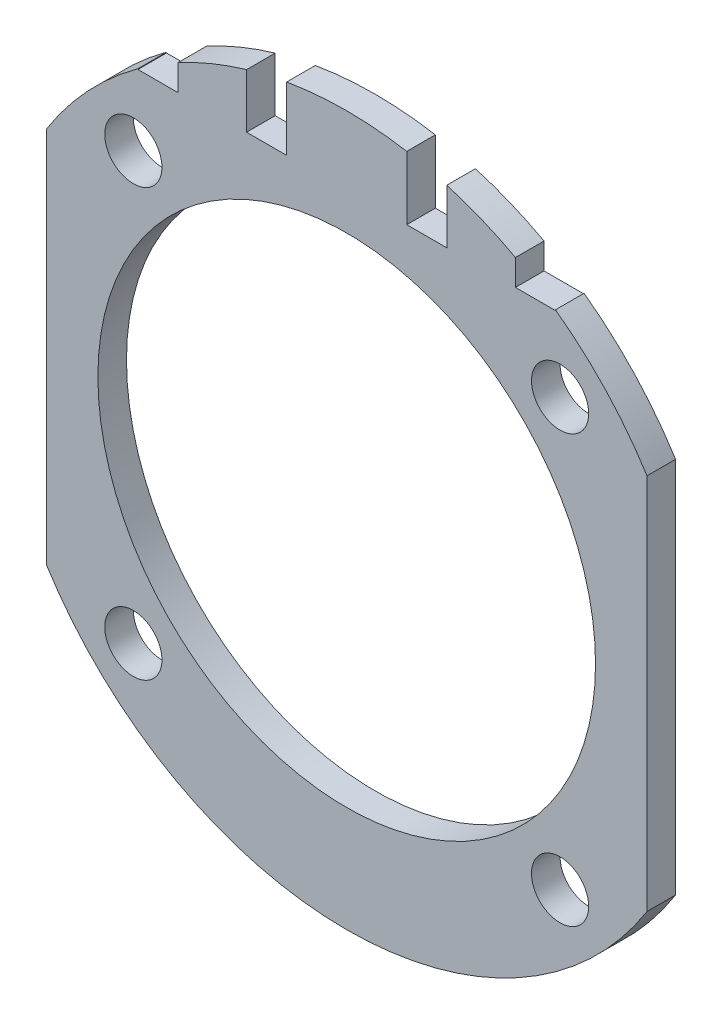
ISO-10303-21;
HEADER;
FILE_DESCRIPTION(('STEP AP214'),'2;1');
FILE_NAME('part.step','',(''),(''),'','','');
FILE_SCHEMA(('AUTOMOTIVE_DESIGN { 1 0 10303 214 1 1 1 1 }'));
ENDSEC;
DATA;
#1=APPLICATION_CONTEXT('core data for automotive mechanical design processes');
#2=APPLICATION_PROTOCOL_DEFINITION('international standard','automotive_design',2000,#1);
#3=PRODUCT_CONTEXT('',#1,'mechanical');
#4=PRODUCT('Part','Part','',(#3));
#5=PRODUCT_RELATED_PRODUCT_CATEGORY('part','',(#4));
#6=PRODUCT_DEFINITION_FORMATION('','',#4);
#7=PRODUCT_DEFINITION_CONTEXT('part definition',#1,'design');
#8=PRODUCT_DEFINITION('design','',#6,#7);
#9=PRODUCT_DEFINITION_SHAPE('','',#8);
#10=(LENGTH_UNIT() NAMED_UNIT(*) SI_UNIT(.MILLI.,.METRE.));
#11=(NAMED_UNIT(*) PLANE_ANGLE_UNIT() SI_UNIT($,.RADIAN.));
#12=(NAMED_UNIT(*) SI_UNIT($,.STERADIAN.) SOLID_ANGLE_UNIT());
#13=UNCERTAINTY_MEASURE_WITH_UNIT(LENGTH_MEASURE(1.E-05),#10,'distance_accuracy_value','');
#14=(GEOMETRIC_REPRESENTATION_CONTEXT(3) GLOBAL_UNCERTAINTY_ASSIGNED_CONTEXT((#13)) GLOBAL_UNIT_ASSIGNED_CONTEXT((#10,
#11,#12)) REPRESENTATION_CONTEXT('',''));
#15=CARTESIAN_POINT('',(0.,0.,0.));
#16=DIRECTION('',(0.,0.,1.));
#17=DIRECTION('',(1.,0.,0.));
#18=AXIS2_PLACEMENT_3D('',#15,#16,#17);
#19=CARTESIAN_POINT('',(0.,0.,5.));
#20=DIRECTION('',(0.,0.,-1.));
#21=DIRECTION('',(-1.,0.,0.));
#22=AXIS2_PLACEMENT_3D('',#19,#20,#21);
#23=CYLINDRICAL_SURFACE('',#22,124.);
#24=CARTESIAN_POINT('',(0.,0.,-5.));
#25=DIRECTION('',(0.,0.,1.));
#26=DIRECTION('',(1.,0.,0.));
#27=AXIS2_PLACEMENT_3D('',#24,#25,#26);
#28=CIRCLE('',#27,124.);
#29=CARTESIAN_POINT('',(-35.0000000000592,118.957975772942,-5.));
#30=VERTEX_POINT('',#29);
#31=CARTESIAN_POINT('',(-59.,109.064201276129,-5.));
#32=VERTEX_POINT('',#31);
#33=EDGE_CURVE('E423',#30,#32,#28,.T.);
#34=ORIENTED_EDGE('',*,*,#33,.T.);
#35=DIRECTION('',(0.,0.,-1.));
#36=VECTOR('',#35,1.);
#37=CARTESIAN_POINT('',(-59.,109.064201276129,5.));
#38=LINE('',#37,#36);
#39=CARTESIAN_POINT('',(-59.,109.064201276129,5.));
#40=VERTEX_POINT('',#39);
#41=EDGE_CURVE('E12',#32,#40,#38,.F.);
#42=ORIENTED_EDGE('',*,*,#41,.T.);
#43=CARTESIAN_POINT('',(0.,0.,5.));
#44=DIRECTION('',(0.,0.,1.));
#45=DIRECTION('',(1.,0.,0.));
#46=AXIS2_PLACEMENT_3D('',#43,#44,#45);
#47=CIRCLE('',#46,124.);
#48=CARTESIAN_POINT('',(-35.0000000000592,118.957975772942,5.));
#49=VERTEX_POINT('',#48);
#50=EDGE_CURVE('E462',#49,#40,#47,.T.);
#51=ORIENTED_EDGE('',*,*,#50,.F.);
#52=DIRECTION('',(0.,0.,-1.));
#53=VECTOR('',#52,1.);
#54=CARTESIAN_POINT('',(-35.0000000000592,118.957975772942,5.));
#55=LINE('',#54,#53);
#56=EDGE_CURVE('E393',#49,#30,#55,.T.);
#57=ORIENTED_EDGE('',*,*,#56,.T.);
#58=EDGE_LOOP('',(#34,#42,#51,#57));
#59=FACE_BOUND('',#58,.T.);
#60=ADVANCED_FACE('F44',(#59),#23,.T.);
#61=CARTESIAN_POINT('',(59.,109.064201276129,-5.));
#62=VERTEX_POINT('',#61);
#63=CARTESIAN_POINT('',(34.9999999999409,118.957975772977,-5.));
#64=VERTEX_POINT('',#63);
#65=EDGE_CURVE('E372',#62,#64,#28,.T.);
#66=ORIENTED_EDGE('',*,*,#65,.T.);
#67=DIRECTION('',(0.,0.,-1.));
#68=VECTOR('',#67,1.);
#69=CARTESIAN_POINT('',(34.9999999999409,118.957975772977,5.));
#70=LINE('',#69,#68);
#71=CARTESIAN_POINT('',(34.9999999999409,118.957975772977,5.));
#72=VERTEX_POINT('',#71);
#73=EDGE_CURVE('E404',#64,#72,#70,.F.);
#74=ORIENTED_EDGE('',*,*,#73,.T.);
#75=CARTESIAN_POINT('',(59.,109.064201276129,5.));
#76=VERTEX_POINT('',#75);
#77=EDGE_CURVE('E365',#76,#72,#47,.T.);
#78=ORIENTED_EDGE('',*,*,#77,.F.);
#79=DIRECTION('',(0.,0.,-1.));
#80=VECTOR('',#79,1.);
#81=CARTESIAN_POINT('',(59.,109.064201276129,5.));
#82=LINE('',#81,#80);
#83=EDGE_CURVE('E385',#76,#62,#82,.T.);
#84=ORIENTED_EDGE('',*,*,#83,.T.);
#85=EDGE_LOOP('',(#66,#74,#78,#84));
#86=FACE_BOUND('',#85,.T.);
#87=ADVANCED_FACE('F445',(#86),#23,.T.);
#88=CARTESIAN_POINT('',(20.9999999999419,122.208837650975,5.));
#89=VERTEX_POINT('',#88);
#90=CARTESIAN_POINT('',(-21.0000000000592,122.208837650955,5.));
#91=VERTEX_POINT('',#90);
#92=EDGE_CURVE('E458',#89,#91,#47,.T.);
#93=ORIENTED_EDGE('',*,*,#92,.F.);
#94=DIRECTION('',(0.,0.,-1.));
#95=VECTOR('',#94,1.);
#96=CARTESIAN_POINT('',(20.9999999999419,122.208837650975,5.));
#97=LINE('',#96,#95);
#98=CARTESIAN_POINT('',(20.9999999999419,122.208837650975,-5.));
#99=VERTEX_POINT('',#98);
#100=EDGE_CURVE('E400',#89,#99,#97,.T.);
#101=ORIENTED_EDGE('',*,*,#100,.T.);
#102=CARTESIAN_POINT('',(-21.0000000000592,122.208837650955,-5.));
#103=VERTEX_POINT('',#102);
#104=EDGE_CURVE('E427',#99,#103,#28,.T.);
#105=ORIENTED_EDGE('',*,*,#104,.T.);
#106=DIRECTION('',(0.,0.,-1.));
#107=VECTOR('',#106,1.);
#108=CARTESIAN_POINT('',(-21.0000000000592,122.208837650955,5.));
#109=LINE('',#108,#107);
#110=EDGE_CURVE('E396',#103,#91,#109,.F.);
#111=ORIENTED_EDGE('',*,*,#110,.T.);
#112=EDGE_LOOP('',(#93,#101,#105,#111));
#113=FACE_BOUND('',#112,.T.);
#114=ADVANCED_FACE('F483',(#113),#23,.T.);
#115=CARTESIAN_POINT('',(105.,65.962110336162,-5.));
#116=VERTEX_POINT('',#115);
#117=CARTESIAN_POINT('',(73.,100.234724521994,-5.));
#118=VERTEX_POINT('',#117);
#119=EDGE_CURVE('E368',#116,#118,#28,.T.);
#120=ORIENTED_EDGE('',*,*,#119,.T.);
#121=DIRECTION('',(0.,0.,-1.));
#122=VECTOR('',#121,1.);
#123=CARTESIAN_POINT('',(73.,100.234724521994,5.));
#124=LINE('',#123,#122);
#125=CARTESIAN_POINT('',(73.,100.234724521994,5.));
#126=VERTEX_POINT('',#125);
#127=EDGE_CURVE('E389',#118,#126,#124,.F.);
#128=ORIENTED_EDGE('',*,*,#127,.T.);
#129=CARTESIAN_POINT('',(105.,65.962110336162,5.));
#130=VERTEX_POINT('',#129);
#131=EDGE_CURVE('E360',#130,#126,#47,.T.);
#132=ORIENTED_EDGE('',*,*,#131,.F.);
#133=DIRECTION('',(0.,0.,-1.));
#134=VECTOR('',#133,1.);
#135=CARTESIAN_POINT('',(105.,65.962110336162,5.));
#136=LINE('',#135,#134);
#137=EDGE_CURVE('E379',#116,#130,#136,.F.);
#138=ORIENTED_EDGE('',*,*,#137,.F.);
#139=EDGE_LOOP('',(#120,#128,#132,#138));
#140=FACE_BOUND('',#139,.T.);
#141=ADVANCED_FACE('F512',(#140),#23,.T.);
#142=CARTESIAN_POINT('',(0.,0.,5.));
#143=DIRECTION('',(0.,0.,1.));
#144=DIRECTION('',(1.,0.,0.));
#145=AXIS2_PLACEMENT_3D('',#142,#143,#144);
#146=PLANE('',#145);
#147=DIRECTION('',(0.,1.,0.));
#148=VECTOR('',#147,1.);
#149=CARTESIAN_POINT('',(-59.,0.,5.));
#150=LINE('',#149,#148);
#151=CARTESIAN_POINT('',(-59.,100.,5.));
#152=VERTEX_POINT('',#151);
#153=EDGE_CURVE('E290',#152,#40,#150,.T.);
#154=ORIENTED_EDGE('',*,*,#153,.F.);
#155=DIRECTION('',(1.,0.,0.));
#156=VECTOR('',#155,1.);
#157=CARTESIAN_POINT('',(0.,100.,5.));
#158=LINE('',#157,#156);
#159=CARTESIAN_POINT('',(-73.,100.,5.));
#160=VERTEX_POINT('',#159);
#161=EDGE_CURVE('E302',#160,#152,#158,.T.);
#162=ORIENTED_EDGE('',*,*,#161,.F.);
#163=DIRECTION('',(0.,-1.,0.));
#164=VECTOR('',#163,1.);
#165=CARTESIAN_POINT('',(-73.,0.,5.));
#166=LINE('',#165,#164);
#167=CARTESIAN_POINT('',(-73.,100.234724521994,5.));
#168=VERTEX_POINT('',#167);
#169=EDGE_CURVE('E184',#168,#160,#166,.T.);
#170=ORIENTED_EDGE('',*,*,#169,.F.);
#171=CARTESIAN_POINT('',(-105.,65.9621103361619,5.));
#172=VERTEX_POINT('',#171);
#173=EDGE_CURVE('E366',#168,#172,#47,.T.);
#174=ORIENTED_EDGE('',*,*,#173,.T.);
#175=DIRECTION('',(0.,-1.,0.));
#176=VECTOR('',#175,1.);
#177=CARTESIAN_POINT('',(-105.,0.,5.));
#178=LINE('',#177,#176);
#179=CARTESIAN_POINT('',(-105.,-65.9621103361619,5.));
#180=VERTEX_POINT('',#179);
#181=EDGE_CURVE('E311',#172,#180,#178,.T.);
#182=ORIENTED_EDGE('',*,*,#181,.T.);
#183=CARTESIAN_POINT('',(105.,-65.962110336162,5.));
#184=VERTEX_POINT('',#183);
#185=EDGE_CURVE('E367',#180,#184,#47,.T.);
#186=ORIENTED_EDGE('',*,*,#185,.T.);
#187=DIRECTION('',(0.,1.,0.));
#188=VECTOR('',#187,1.);
#189=CARTESIAN_POINT('',(105.,0.,5.));
#190=LINE('',#189,#188);
#191=EDGE_CURVE('E315',#184,#130,#190,.T.);
#192=ORIENTED_EDGE('',*,*,#191,.T.);
#193=ORIENTED_EDGE('',*,*,#131,.T.);
#194=DIRECTION('',(0.,1.,0.));
#195=VECTOR('',#194,1.);
#196=CARTESIAN_POINT('',(73.,0.,5.));
#197=LINE('',#196,#195);
#198=CARTESIAN_POINT('',(73.,100.,5.));
#199=VERTEX_POINT('',#198);
#200=EDGE_CURVE('E273',#199,#126,#197,.T.);
#201=ORIENTED_EDGE('',*,*,#200,.F.);
#202=DIRECTION('',(1.,0.,0.));
#203=VECTOR('',#202,1.);
#204=CARTESIAN_POINT('',(0.,100.,5.));
#205=LINE('',#204,#203);
#206=CARTESIAN_POINT('',(59.,100.,5.));
#207=VERTEX_POINT('',#206);
#208=EDGE_CURVE('E293',#207,#199,#205,.T.);
#209=ORIENTED_EDGE('',*,*,#208,.F.);
#210=DIRECTION('',(0.,-1.,0.));
#211=VECTOR('',#210,1.);
#212=CARTESIAN_POINT('',(59.,0.,5.));
#213=LINE('',#212,#211);
#214=EDGE_CURVE('E212',#76,#207,#213,.T.);
#215=ORIENTED_EDGE('',*,*,#214,.F.);
#216=ORIENTED_EDGE('',*,*,#77,.T.);
#217=DIRECTION('',(0.,1.,0.));
#218=VECTOR('',#217,1.);
#219=CARTESIAN_POINT('',(34.9999999999409,0.,5.));
#220=LINE('',#219,#218);
#221=CARTESIAN_POINT('',(34.9999999999409,99.9999999999815,5.));
#222=VERTEX_POINT('',#221);
#223=EDGE_CURVE('E285',#222,#72,#220,.T.);
#224=ORIENTED_EDGE('',*,*,#223,.F.);
#225=DIRECTION('',(1.,0.,0.));
#226=VECTOR('',#225,1.);
#227=CARTESIAN_POINT('',(0.,99.9999999999815,5.));
#228=LINE('',#227,#226);
#229=CARTESIAN_POINT('',(20.9999999999419,99.9999999999815,5.));
#230=VERTEX_POINT('',#229);
#231=EDGE_CURVE('E299',#230,#222,#228,.T.);
#232=ORIENTED_EDGE('',*,*,#231,.F.);
#233=DIRECTION('',(0.,-1.,0.));
#234=VECTOR('',#233,1.);
#235=CARTESIAN_POINT('',(20.9999999999419,0.,5.));
#236=LINE('',#235,#234);
#237=EDGE_CURVE('E282',#89,#230,#236,.T.);
#238=ORIENTED_EDGE('',*,*,#237,.F.);
#239=ORIENTED_EDGE('',*,*,#92,.T.);
#240=DIRECTION('',(0.,1.,0.));
#241=VECTOR('',#240,1.);
#242=CARTESIAN_POINT('',(-21.0000000000592,0.,5.));
#243=LINE('',#242,#241);
#244=CARTESIAN_POINT('',(-21.0000000000592,99.9999999999815,5.));
#245=VERTEX_POINT('',#244);
#246=EDGE_CURVE('E279',#245,#91,#243,.T.);
#247=ORIENTED_EDGE('',*,*,#246,.F.);
#248=DIRECTION('',(1.,0.,0.));
#249=VECTOR('',#248,1.);
#250=CARTESIAN_POINT('',(0.,99.9999999999815,5.));
#251=LINE('',#250,#249);
#252=CARTESIAN_POINT('',(-35.0000000000592,99.9999999999815,5.));
#253=VERTEX_POINT('',#252);
#254=EDGE_CURVE('E296',#253,#245,#251,.T.);
#255=ORIENTED_EDGE('',*,*,#254,.F.);
#256=DIRECTION('',(0.,-1.,0.));
#257=VECTOR('',#256,1.);
#258=CARTESIAN_POINT('',(-35.0000000000592,0.,5.));
#259=LINE('',#258,#257);
#260=EDGE_CURVE('E276',#49,#253,#259,.T.);
#261=ORIENTED_EDGE('',*,*,#260,.F.);
#262=ORIENTED_EDGE('',*,*,#50,.T.);
#263=EDGE_LOOP('',(#154,#162,#170,#174,#182,#186,#192,#193,#201,#209,#215,#216,#224,#232,#238,
#239,#247,#255,#261,#262));
#264=FACE_BOUND('',#263,.T.);
#265=CARTESIAN_POINT('',(-74.5997654151803,-74.5997654151812,5.));
#266=DIRECTION('',(0.,0.,1.));
#267=DIRECTION('',(1.,0.,0.));
#268=AXIS2_PLACEMENT_3D('',#265,#266,#267);
#269=CIRCLE('',#268,9.99999999999999);
#270=CARTESIAN_POINT('',(-64.5997654151803,-74.5997654151812,5.));
#271=VERTEX_POINT('',#270);
#272=EDGE_CURVE('E328',#271,#271,#269,.T.);
#273=ORIENTED_EDGE('',*,*,#272,.F.);
#274=EDGE_LOOP('',(#273));
#275=FACE_BOUND('',#274,.T.);
#276=CARTESIAN_POINT('',(74.5997654151803,74.5997654151812,5.));
#277=DIRECTION('',(0.,0.,1.));
#278=DIRECTION('',(1.,0.,0.));
#279=AXIS2_PLACEMENT_3D('',#276,#277,#278);
#280=CIRCLE('',#279,9.99999999999999);
#281=CARTESIAN_POINT('',(84.5997654151803,74.5997654151812,5.));
#282=VERTEX_POINT('',#281);
#283=EDGE_CURVE('E344',#282,#282,#280,.T.);
#284=ORIENTED_EDGE('',*,*,#283,.F.);
#285=EDGE_LOOP('',(#284));
#286=FACE_BOUND('',#285,.T.);
#287=CARTESIAN_POINT('',(0.,0.,5.));
#288=DIRECTION('',(0.,0.,1.));
#289=DIRECTION('',(1.,0.,0.));
#290=AXIS2_PLACEMENT_3D('',#287,#288,#289);
#291=CIRCLE('',#290,87.);
#292=CARTESIAN_POINT('',(87.,0.,5.));
#293=VERTEX_POINT('',#292);
#294=EDGE_CURVE('E352',#293,#293,#291,.T.);
#295=ORIENTED_EDGE('',*,*,#294,.F.);
#296=EDGE_LOOP('',(#295));
#297=FACE_BOUND('',#296,.T.);
#298=CARTESIAN_POINT('',(74.5997654151812,-74.5997654151803,5.));
#299=DIRECTION('',(0.,0.,1.));
#300=DIRECTION('',(1.,0.,0.));
#301=AXIS2_PLACEMENT_3D('',#298,#299,#300);
#302=CIRCLE('',#301,9.99999999999999);
#303=CARTESIAN_POINT('',(84.5997654151812,-74.5997654151803,5.));
#304=VERTEX_POINT('',#303);
#305=EDGE_CURVE('E336',#304,#304,#302,.T.);
#306=ORIENTED_EDGE('',*,*,#305,.F.);
#307=EDGE_LOOP('',(#306));
#308=FACE_BOUND('',#307,.T.);
#309=CARTESIAN_POINT('',(-74.5997654151812,74.5997654151803,5.));
#310=DIRECTION('',(0.,0.,1.));
#311=DIRECTION('',(1.,0.,0.));
#312=AXIS2_PLACEMENT_3D('',#309,#310,#311);
#313=CIRCLE('',#312,9.99999999999999);
#314=CARTESIAN_POINT('',(-64.5997654151812,74.5997654151803,5.));
#315=VERTEX_POINT('',#314);
#316=EDGE_CURVE('E320',#315,#315,#313,.T.);
#317=ORIENTED_EDGE('',*,*,#316,.F.);
#318=EDGE_LOOP('',(#317));
#319=FACE_BOUND('',#318,.T.);
#320=ADVANCED_FACE('F415',(#264,#275,#286,#297,#308,#319),#146,.T.);
#321=CARTESIAN_POINT('',(0.,0.,-5.));
#322=DIRECTION('',(0.,0.,1.));
#323=DIRECTION('',(1.,0.,0.));
#324=AXIS2_PLACEMENT_3D('',#321,#322,#323);
#325=PLANE('',#324);
#326=CARTESIAN_POINT('',(0.,0.,-5.));
#327=DIRECTION('',(0.,0.,1.));
#328=DIRECTION('',(1.,0.,0.));
#329=AXIS2_PLACEMENT_3D('',#326,#327,#328);
#330=CIRCLE('',#329,87.);
#331=CARTESIAN_POINT('',(87.,0.,-5.));
#332=VERTEX_POINT('',#331);
#333=EDGE_CURVE('E348',#332,#332,#330,.T.);
#334=ORIENTED_EDGE('',*,*,#333,.T.);
#335=EDGE_LOOP('',(#334));
#336=FACE_BOUND('',#335,.T.);
#337=CARTESIAN_POINT('',(74.5997654151803,74.5997654151812,-5.));
#338=DIRECTION('',(0.,0.,1.));
#339=DIRECTION('',(1.,0.,0.));
#340=AXIS2_PLACEMENT_3D('',#337,#338,#339);
#341=CIRCLE('',#340,9.99999999999999);
#342=CARTESIAN_POINT('',(84.5997654151803,74.5997654151812,-5.));
#343=VERTEX_POINT('',#342);
#344=EDGE_CURVE('E340',#343,#343,#341,.T.);
#345=ORIENTED_EDGE('',*,*,#344,.T.);
#346=EDGE_LOOP('',(#345));
#347=FACE_BOUND('',#346,.T.);
#348=CARTESIAN_POINT('',(74.5997654151812,-74.5997654151803,-5.));
#349=DIRECTION('',(0.,0.,1.));
#350=DIRECTION('',(1.,0.,0.));
#351=AXIS2_PLACEMENT_3D('',#348,#349,#350);
#352=CIRCLE('',#351,9.99999999999999);
#353=CARTESIAN_POINT('',(84.5997654151812,-74.5997654151803,-5.));
#354=VERTEX_POINT('',#353);
#355=EDGE_CURVE('E332',#354,#354,#352,.T.);
#356=ORIENTED_EDGE('',*,*,#355,.T.);
#357=EDGE_LOOP('',(#356));
#358=FACE_BOUND('',#357,.T.);
#359=CARTESIAN_POINT('',(-74.5997654151803,-74.5997654151812,-5.));
#360=DIRECTION('',(0.,0.,1.));
#361=DIRECTION('',(1.,0.,0.));
#362=AXIS2_PLACEMENT_3D('',#359,#360,#361);
#363=CIRCLE('',#362,9.99999999999999);
#364=CARTESIAN_POINT('',(-64.5997654151803,-74.5997654151812,-5.));
#365=VERTEX_POINT('',#364);
#366=EDGE_CURVE('E324',#365,#365,#363,.T.);
#367=ORIENTED_EDGE('',*,*,#366,.T.);
#368=EDGE_LOOP('',(#367));
#369=FACE_BOUND('',#368,.T.);
#370=CARTESIAN_POINT('',(-74.5997654151812,74.5997654151803,-5.));
#371=DIRECTION('',(0.,0.,1.));
#372=DIRECTION('',(1.,0.,0.));
#373=AXIS2_PLACEMENT_3D('',#370,#371,#372);
#374=CIRCLE('',#373,9.99999999999999);
#375=CARTESIAN_POINT('',(-64.5997654151812,74.5997654151803,-5.));
#376=VERTEX_POINT('',#375);
#377=EDGE_CURVE('E319',#376,#376,#374,.T.);
#378=ORIENTED_EDGE('',*,*,#377,.T.);
#379=EDGE_LOOP('',(#378));
#380=FACE_BOUND('',#379,.T.);
#381=DIRECTION('',(1.,0.,0.));
#382=VECTOR('',#381,1.);
#383=CARTESIAN_POINT('',(-73.,100.,-5.));
#384=LINE('',#383,#382);
#385=CARTESIAN_POINT('',(-73.,100.,-5.));
#386=VERTEX_POINT('',#385);
#387=CARTESIAN_POINT('',(-59.,100.,-5.));
#388=VERTEX_POINT('',#387);
#389=EDGE_CURVE('E189',#386,#388,#384,.T.);
#390=ORIENTED_EDGE('',*,*,#389,.T.);
#391=DIRECTION('',(0.,1.,0.));
#392=VECTOR('',#391,1.);
#393=CARTESIAN_POINT('',(-59.,100.,-5.));
#394=LINE('',#393,#392);
#395=EDGE_CURVE('E204',#388,#32,#394,.T.);
#396=ORIENTED_EDGE('',*,*,#395,.T.);
#397=ORIENTED_EDGE('',*,*,#33,.F.);
#398=DIRECTION('',(0.,-1.,0.));
#399=VECTOR('',#398,1.);
#400=CARTESIAN_POINT('',(-35.0000000000592,99.9999999999815,-5.));
#401=LINE('',#400,#399);
#402=CARTESIAN_POINT('',(-35.0000000000592,99.9999999999815,-5.));
#403=VERTEX_POINT('',#402);
#404=EDGE_CURVE('E68',#30,#403,#401,.T.);
#405=ORIENTED_EDGE('',*,*,#404,.T.);
#406=DIRECTION('',(1.,0.,0.));
#407=VECTOR('',#406,1.);
#408=CARTESIAN_POINT('',(-21.0000000000592,99.9999999999815,-5.));
#409=LINE('',#408,#407);
#410=CARTESIAN_POINT('',(-21.0000000000592,99.9999999999815,-5.));
#411=VERTEX_POINT('',#410);
#412=EDGE_CURVE('E238',#403,#411,#409,.T.);
#413=ORIENTED_EDGE('',*,*,#412,.T.);
#414=DIRECTION('',(0.,1.,0.));
#415=VECTOR('',#414,1.);
#416=CARTESIAN_POINT('',(-21.0000000000592,99.9999999999815,-5.));
#417=LINE('',#416,#415);
#418=EDGE_CURVE('E223',#411,#103,#417,.T.);
#419=ORIENTED_EDGE('',*,*,#418,.T.);
#420=ORIENTED_EDGE('',*,*,#104,.F.);
#421=DIRECTION('',(0.,-1.,0.));
#422=VECTOR('',#421,1.);
#423=CARTESIAN_POINT('',(20.9999999999419,148.,-5.));
#424=LINE('',#423,#422);
#425=CARTESIAN_POINT('',(20.9999999999419,99.9999999999815,-5.));
#426=VERTEX_POINT('',#425);
#427=EDGE_CURVE('E227',#99,#426,#424,.T.);
#428=ORIENTED_EDGE('',*,*,#427,.T.);
#429=DIRECTION('',(1.,0.,0.));
#430=VECTOR('',#429,1.);
#431=CARTESIAN_POINT('',(34.9999999999409,99.9999999999815,-5.));
#432=LINE('',#431,#430);
#433=CARTESIAN_POINT('',(34.9999999999409,99.9999999999815,-5.));
#434=VERTEX_POINT('',#433);
#435=EDGE_CURVE('E218',#426,#434,#432,.T.);
#436=ORIENTED_EDGE('',*,*,#435,.T.);
#437=DIRECTION('',(0.,1.,0.));
#438=VECTOR('',#437,1.);
#439=CARTESIAN_POINT('',(34.9999999999409,148.,-5.));
#440=LINE('',#439,#438);
#441=EDGE_CURVE('E208',#434,#64,#440,.T.);
#442=ORIENTED_EDGE('',*,*,#441,.T.);
#443=ORIENTED_EDGE('',*,*,#65,.F.);
#444=DIRECTION('',(0.,-1.,0.));
#445=VECTOR('',#444,1.);
#446=CARTESIAN_POINT('',(59.,148.,-5.));
#447=LINE('',#446,#445);
#448=CARTESIAN_POINT('',(59.,100.,-5.));
#449=VERTEX_POINT('',#448);
#450=EDGE_CURVE('E243',#62,#449,#447,.T.);
#451=ORIENTED_EDGE('',*,*,#450,.T.);
#452=DIRECTION('',(1.,0.,0.));
#453=VECTOR('',#452,1.);
#454=CARTESIAN_POINT('',(59.,100.,-5.));
#455=LINE('',#454,#453);
#456=CARTESIAN_POINT('',(73.,100.,-5.));
#457=VERTEX_POINT('',#456);
#458=EDGE_CURVE('E264',#449,#457,#455,.T.);
#459=ORIENTED_EDGE('',*,*,#458,.T.);
#460=DIRECTION('',(0.,1.,0.));
#461=VECTOR('',#460,1.);
#462=CARTESIAN_POINT('',(73.,100.,-5.));
#463=LINE('',#462,#461);
#464=EDGE_CURVE('E256',#457,#118,#463,.T.);
#465=ORIENTED_EDGE('',*,*,#464,.T.);
#466=ORIENTED_EDGE('',*,*,#119,.F.);
#467=DIRECTION('',(0.,1.,0.));
#468=VECTOR('',#467,1.);
#469=CARTESIAN_POINT('',(105.,-140.,-5.));
#470=LINE('',#469,#468);
#471=CARTESIAN_POINT('',(105.,-65.962110336162,-5.));
#472=VERTEX_POINT('',#471);
#473=EDGE_CURVE('E305',#472,#116,#470,.T.);
#474=ORIENTED_EDGE('',*,*,#473,.F.);
#475=CARTESIAN_POINT('',(-105.,-65.9621103361619,-5.));
#476=VERTEX_POINT('',#475);
#477=EDGE_CURVE('E356',#476,#472,#28,.T.);
#478=ORIENTED_EDGE('',*,*,#477,.F.);
#479=DIRECTION('',(0.,-1.,0.));
#480=VECTOR('',#479,1.);
#481=CARTESIAN_POINT('',(-105.,-140.,-5.));
#482=LINE('',#481,#480);
#483=CARTESIAN_POINT('',(-105.,65.9621103361619,-5.));
#484=VERTEX_POINT('',#483);
#485=EDGE_CURVE('E308',#484,#476,#482,.T.);
#486=ORIENTED_EDGE('',*,*,#485,.F.);
#487=CARTESIAN_POINT('',(-73.,100.234724521994,-5.));
#488=VERTEX_POINT('',#487);
#489=EDGE_CURVE('E202',#488,#484,#28,.T.);
#490=ORIENTED_EDGE('',*,*,#489,.F.);
#491=DIRECTION('',(0.,-1.,0.));
#492=VECTOR('',#491,1.);
#493=CARTESIAN_POINT('',(-73.,148.,-5.));
#494=LINE('',#493,#492);
#495=EDGE_CURVE('E60',#488,#386,#494,.T.);
#496=ORIENTED_EDGE('',*,*,#495,.T.);
#497=EDGE_LOOP('',(#390,#396,#397,#405,#413,#419,#420,#428,#436,#442,#443,#451,#459,#465,#466,
#474,#478,#486,#490,#496));
#498=FACE_BOUND('',#497,.T.);
#499=ADVANCED_FACE('F200',(#336,#347,#358,#369,#380,#498),#325,.F.);
#500=DIRECTION('',(0.,0.,-1.));
#501=VECTOR('',#500,1.);
#502=CARTESIAN_POINT('',(105.,-65.962110336162,5.));
#503=LINE('',#502,#501);
#504=EDGE_CURVE('E382',#184,#472,#503,.T.);
#505=ORIENTED_EDGE('',*,*,#504,.F.);
#506=ORIENTED_EDGE('',*,*,#185,.F.);
#507=DIRECTION('',(0.,0.,-1.));
#508=VECTOR('',#507,1.);
#509=CARTESIAN_POINT('',(-105.,-65.9621103361619,5.));
#510=LINE('',#509,#508);
#511=EDGE_CURVE('E364',#476,#180,#510,.F.);
#512=ORIENTED_EDGE('',*,*,#511,.F.);
#513=ORIENTED_EDGE('',*,*,#477,.T.);
#514=EDGE_LOOP('',(#505,#506,#512,#513));
#515=FACE_BOUND('',#514,.T.);
#516=ADVANCED_FACE('F46',(#515),#23,.T.);
#517=ORIENTED_EDGE('',*,*,#173,.F.);
#518=DIRECTION('',(0.,0.,-1.));
#519=VECTOR('',#518,1.);
#520=CARTESIAN_POINT('',(-73.,100.234724521994,5.));
#521=LINE('',#520,#519);
#522=EDGE_CURVE('E53',#168,#488,#521,.T.);
#523=ORIENTED_EDGE('',*,*,#522,.T.);
#524=ORIENTED_EDGE('',*,*,#489,.T.);
#525=DIRECTION('',(0.,0.,-1.));
#526=VECTOR('',#525,1.);
#527=CARTESIAN_POINT('',(-105.,65.9621103361619,5.));
#528=LINE('',#527,#526);
#529=EDGE_CURVE('E375',#172,#484,#528,.T.);
#530=ORIENTED_EDGE('',*,*,#529,.F.);
#531=EDGE_LOOP('',(#517,#523,#524,#530));
#532=FACE_BOUND('',#531,.T.);
#533=ADVANCED_FACE('F411',(#532),#23,.T.);
#534=CARTESIAN_POINT('',(0.,0.,5.));
#535=DIRECTION('',(0.,0.,-1.));
#536=DIRECTION('',(-1.,0.,0.));
#537=AXIS2_PLACEMENT_3D('',#534,#535,#536);
#538=CYLINDRICAL_SURFACE('',#537,87.);
#539=ORIENTED_EDGE('',*,*,#294,.T.);
#540=EDGE_LOOP('',(#539));
#541=FACE_BOUND('',#540,.T.);
#542=ORIENTED_EDGE('',*,*,#333,.F.);
#543=EDGE_LOOP('',(#542));
#544=FACE_BOUND('',#543,.T.);
#545=ADVANCED_FACE('F511',(#541,#544),#538,.F.);
#546=CARTESIAN_POINT('',(74.5997654151803,74.5997654151812,5.));
#547=DIRECTION('',(0.,0.,-1.));
#548=DIRECTION('',(-1.,0.,0.));
#549=AXIS2_PLACEMENT_3D('',#546,#547,#548);
#550=CYLINDRICAL_SURFACE('',#549,9.99999999999999);
#551=ORIENTED_EDGE('',*,*,#283,.T.);
#552=EDGE_LOOP('',(#551));
#553=FACE_BOUND('',#552,.T.);
#554=ORIENTED_EDGE('',*,*,#344,.F.);
#555=EDGE_LOOP('',(#554));
#556=FACE_BOUND('',#555,.T.);
#557=ADVANCED_FACE('F549',(#553,#556),#550,.F.);
#558=CARTESIAN_POINT('',(74.5997654151812,-74.5997654151803,5.));
#559=DIRECTION('',(0.,0.,-1.));
#560=DIRECTION('',(-1.,0.,0.));
#561=AXIS2_PLACEMENT_3D('',#558,#559,#560);
#562=CYLINDRICAL_SURFACE('',#561,9.99999999999999);
#563=ORIENTED_EDGE('',*,*,#305,.T.);
#564=EDGE_LOOP('',(#563));
#565=FACE_BOUND('',#564,.T.);
#566=ORIENTED_EDGE('',*,*,#355,.F.);
#567=EDGE_LOOP('',(#566));
#568=FACE_BOUND('',#567,.T.);
#569=ADVANCED_FACE('F545',(#565,#568),#562,.F.);
#570=CARTESIAN_POINT('',(-74.5997654151803,-74.5997654151812,5.));
#571=DIRECTION('',(0.,0.,-1.));
#572=DIRECTION('',(-1.,0.,0.));
#573=AXIS2_PLACEMENT_3D('',#570,#571,#572);
#574=CYLINDRICAL_SURFACE('',#573,9.99999999999999);
#575=ORIENTED_EDGE('',*,*,#272,.T.);
#576=EDGE_LOOP('',(#575));
#577=FACE_BOUND('',#576,.T.);
#578=ORIENTED_EDGE('',*,*,#366,.F.);
#579=EDGE_LOOP('',(#578));
#580=FACE_BOUND('',#579,.T.);
#581=ADVANCED_FACE('F541',(#577,#580),#574,.F.);
#582=CARTESIAN_POINT('',(-74.5997654151812,74.5997654151803,5.));
#583=DIRECTION('',(0.,0.,-1.));
#584=DIRECTION('',(-1.,0.,0.));
#585=AXIS2_PLACEMENT_3D('',#582,#583,#584);
#586=CYLINDRICAL_SURFACE('',#585,9.99999999999999);
#587=ORIENTED_EDGE('',*,*,#316,.T.);
#588=EDGE_LOOP('',(#587));
#589=FACE_BOUND('',#588,.T.);
#590=ORIENTED_EDGE('',*,*,#377,.F.);
#591=EDGE_LOOP('',(#590));
#592=FACE_BOUND('',#591,.T.);
#593=ADVANCED_FACE('F537',(#589,#592),#586,.F.);
#594=CARTESIAN_POINT('',(-105.,-140.,-5.));
#595=DIRECTION('',(-1.,0.,0.));
#596=DIRECTION('',(0.,0.,1.));
#597=AXIS2_PLACEMENT_3D('',#594,#595,#596);
#598=PLANE('',#597);
#599=ORIENTED_EDGE('',*,*,#529,.T.);
#600=ORIENTED_EDGE('',*,*,#485,.T.);
#601=ORIENTED_EDGE('',*,*,#511,.T.);
#602=ORIENTED_EDGE('',*,*,#181,.F.);
#603=EDGE_LOOP('',(#599,#600,#601,#602));
#604=FACE_BOUND('',#603,.T.);
#605=ADVANCED_FACE('F535',(#604),#598,.T.);
#606=CARTESIAN_POINT('',(105.,-140.,-5.));
#607=DIRECTION('',(1.,0.,0.));
#608=DIRECTION('',(0.,0.,-1.));
#609=AXIS2_PLACEMENT_3D('',#606,#607,#608);
#610=PLANE('',#609);
#611=ORIENTED_EDGE('',*,*,#504,.T.);
#612=ORIENTED_EDGE('',*,*,#473,.T.);
#613=ORIENTED_EDGE('',*,*,#137,.T.);
#614=ORIENTED_EDGE('',*,*,#191,.F.);
#615=EDGE_LOOP('',(#611,#612,#613,#614));
#616=FACE_BOUND('',#615,.T.);
#617=ADVANCED_FACE('F517',(#616),#610,.T.);
#618=CARTESIAN_POINT('',(73.,100.,-5.));
#619=DIRECTION('',(1.,0.,0.));
#620=DIRECTION('',(0.,0.,-1.));
#621=AXIS2_PLACEMENT_3D('',#618,#619,#620);
#622=PLANE('',#621);
#623=ORIENTED_EDGE('',*,*,#200,.T.);
#624=ORIENTED_EDGE('',*,*,#127,.F.);
#625=ORIENTED_EDGE('',*,*,#464,.F.);
#626=DIRECTION('',(0.,0.,1.));
#627=VECTOR('',#626,1.);
#628=CARTESIAN_POINT('',(73.,100.,-5.));
#629=LINE('',#628,#627);
#630=EDGE_CURVE('E257',#457,#199,#629,.T.);
#631=ORIENTED_EDGE('',*,*,#630,.T.);
#632=EDGE_LOOP('',(#623,#624,#625,#631));
#633=FACE_BOUND('',#632,.T.);
#634=ADVANCED_FACE('F525',(#633),#622,.F.);
#635=CARTESIAN_POINT('',(59.,100.,-5.));
#636=DIRECTION('',(0.,-1.,0.));
#637=DIRECTION('',(0.,0.,-1.));
#638=AXIS2_PLACEMENT_3D('',#635,#636,#637);
#639=PLANE('',#638);
#640=ORIENTED_EDGE('',*,*,#208,.T.);
#641=ORIENTED_EDGE('',*,*,#630,.F.);
#642=ORIENTED_EDGE('',*,*,#458,.F.);
#643=DIRECTION('',(0.,0.,1.));
#644=VECTOR('',#643,1.);
#645=CARTESIAN_POINT('',(59.,100.,-5.));
#646=LINE('',#645,#644);
#647=EDGE_CURVE('E252',#449,#207,#646,.T.);
#648=ORIENTED_EDGE('',*,*,#647,.T.);
#649=EDGE_LOOP('',(#640,#641,#642,#648));
#650=FACE_BOUND('',#649,.T.);
#651=ADVANCED_FACE('F495',(#650),#639,.F.);
#652=CARTESIAN_POINT('',(59.,148.,-5.));
#653=DIRECTION('',(-1.,0.,0.));
#654=DIRECTION('',(0.,-1.,0.));
#655=AXIS2_PLACEMENT_3D('',#652,#653,#654);
#656=PLANE('',#655);
#657=ORIENTED_EDGE('',*,*,#214,.T.);
#658=ORIENTED_EDGE('',*,*,#647,.F.);
#659=ORIENTED_EDGE('',*,*,#450,.F.);
#660=ORIENTED_EDGE('',*,*,#83,.F.);
#661=EDGE_LOOP('',(#657,#658,#659,#660));
#662=FACE_BOUND('',#661,.T.);
#663=ADVANCED_FACE('F488',(#662),#656,.F.);
#664=CARTESIAN_POINT('',(-21.0000000000592,99.9999999999815,-5.));
#665=DIRECTION('',(1.,0.,0.));
#666=DIRECTION('',(0.,0.,-1.));
#667=AXIS2_PLACEMENT_3D('',#664,#665,#666);
#668=PLANE('',#667);
#669=ORIENTED_EDGE('',*,*,#246,.T.);
#670=ORIENTED_EDGE('',*,*,#110,.F.);
#671=ORIENTED_EDGE('',*,*,#418,.F.);
#672=DIRECTION('',(0.,0.,1.));
#673=VECTOR('',#672,1.);
#674=CARTESIAN_POINT('',(-21.0000000000592,99.9999999999815,-5.));
#675=LINE('',#674,#673);
#676=EDGE_CURVE('E239',#411,#245,#675,.T.);
#677=ORIENTED_EDGE('',*,*,#676,.T.);
#678=EDGE_LOOP('',(#669,#670,#671,#677));
#679=FACE_BOUND('',#678,.T.);
#680=ADVANCED_FACE('F486',(#679),#668,.F.);
#681=CARTESIAN_POINT('',(-21.0000000000592,99.9999999999815,-5.));
#682=DIRECTION('',(0.,-1.,0.));
#683=DIRECTION('',(0.,0.,-1.));
#684=AXIS2_PLACEMENT_3D('',#681,#682,#683);
#685=PLANE('',#684);
#686=ORIENTED_EDGE('',*,*,#254,.T.);
#687=ORIENTED_EDGE('',*,*,#676,.F.);
#688=ORIENTED_EDGE('',*,*,#412,.F.);
#689=DIRECTION('',(0.,0.,1.));
#690=VECTOR('',#689,1.);
#691=CARTESIAN_POINT('',(-35.0000000000592,99.9999999999815,-5.));
#692=LINE('',#691,#690);
#693=EDGE_CURVE('E234',#403,#253,#692,.T.);
#694=ORIENTED_EDGE('',*,*,#693,.T.);
#695=EDGE_LOOP('',(#686,#687,#688,#694));
#696=FACE_BOUND('',#695,.T.);
#697=ADVANCED_FACE('F477',(#696),#685,.F.);
#698=CARTESIAN_POINT('',(-35.0000000000592,99.9999999999815,-5.));
#699=DIRECTION('',(-1.,0.,0.));
#700=DIRECTION('',(0.,0.,1.));
#701=AXIS2_PLACEMENT_3D('',#698,#699,#700);
#702=PLANE('',#701);
#703=ORIENTED_EDGE('',*,*,#260,.T.);
#704=ORIENTED_EDGE('',*,*,#693,.F.);
#705=ORIENTED_EDGE('',*,*,#404,.F.);
#706=ORIENTED_EDGE('',*,*,#56,.F.);
#707=EDGE_LOOP('',(#703,#704,#705,#706));
#708=FACE_BOUND('',#707,.T.);
#709=ADVANCED_FACE('F474',(#708),#702,.F.);
#710=CARTESIAN_POINT('',(34.9999999999409,148.,-5.));
#711=DIRECTION('',(1.,0.,0.));
#712=DIRECTION('',(0.,1.,0.));
#713=AXIS2_PLACEMENT_3D('',#710,#711,#712);
#714=PLANE('',#713);
#715=ORIENTED_EDGE('',*,*,#223,.T.);
#716=ORIENTED_EDGE('',*,*,#73,.F.);
#717=ORIENTED_EDGE('',*,*,#441,.F.);
#718=DIRECTION('',(0.,0.,1.));
#719=VECTOR('',#718,1.);
#720=CARTESIAN_POINT('',(34.9999999999409,99.9999999999815,-5.));
#721=LINE('',#720,#719);
#722=EDGE_CURVE('E219',#434,#222,#721,.T.);
#723=ORIENTED_EDGE('',*,*,#722,.T.);
#724=EDGE_LOOP('',(#715,#716,#717,#723));
#725=FACE_BOUND('',#724,.T.);
#726=ADVANCED_FACE('F451',(#725),#714,.F.);
#727=CARTESIAN_POINT('',(34.9999999999409,99.9999999999815,-5.));
#728=DIRECTION('',(0.,-1.,0.));
#729=DIRECTION('',(0.,0.,-1.));
#730=AXIS2_PLACEMENT_3D('',#727,#728,#729);
#731=PLANE('',#730);
#732=ORIENTED_EDGE('',*,*,#231,.T.);
#733=ORIENTED_EDGE('',*,*,#722,.F.);
#734=ORIENTED_EDGE('',*,*,#435,.F.);
#735=DIRECTION('',(0.,0.,1.));
#736=VECTOR('',#735,1.);
#737=CARTESIAN_POINT('',(20.9999999999419,99.9999999999815,-5.));
#738=LINE('',#737,#736);
#739=EDGE_CURVE('E214',#426,#230,#738,.T.);
#740=ORIENTED_EDGE('',*,*,#739,.T.);
#741=EDGE_LOOP('',(#732,#733,#734,#740));
#742=FACE_BOUND('',#741,.T.);
#743=ADVANCED_FACE('F620',(#742),#731,.F.);
#744=CARTESIAN_POINT('',(20.9999999999419,148.,-5.));
#745=DIRECTION('',(-1.,0.,0.));
#746=DIRECTION('',(0.,-1.,0.));
#747=AXIS2_PLACEMENT_3D('',#744,#745,#746);
#748=PLANE('',#747);
#749=ORIENTED_EDGE('',*,*,#237,.T.);
#750=ORIENTED_EDGE('',*,*,#739,.F.);
#751=ORIENTED_EDGE('',*,*,#427,.F.);
#752=ORIENTED_EDGE('',*,*,#100,.F.);
#753=EDGE_LOOP('',(#749,#750,#751,#752));
#754=FACE_BOUND('',#753,.T.);
#755=ADVANCED_FACE('F485',(#754),#748,.F.);
#756=CARTESIAN_POINT('',(-59.,100.,-5.));
#757=DIRECTION('',(1.,0.,0.));
#758=DIRECTION('',(0.,0.,-1.));
#759=AXIS2_PLACEMENT_3D('',#756,#757,#758);
#760=PLANE('',#759);
#761=ORIENTED_EDGE('',*,*,#153,.T.);
#762=ORIENTED_EDGE('',*,*,#41,.F.);
#763=ORIENTED_EDGE('',*,*,#395,.F.);
#764=DIRECTION('',(0.,0.,1.));
#765=VECTOR('',#764,1.);
#766=CARTESIAN_POINT('',(-59.,100.,-5.));
#767=LINE('',#766,#765);
#768=EDGE_CURVE('E188',#388,#152,#767,.T.);
#769=ORIENTED_EDGE('',*,*,#768,.T.);
#770=EDGE_LOOP('',(#761,#762,#763,#769));
#771=FACE_BOUND('',#770,.T.);
#772=ADVANCED_FACE('F420',(#771),#760,.F.);
#773=CARTESIAN_POINT('',(-73.,100.,-5.));
#774=DIRECTION('',(0.,-1.,0.));
#775=DIRECTION('',(0.,0.,-1.));
#776=AXIS2_PLACEMENT_3D('',#773,#774,#775);
#777=PLANE('',#776);
#778=ORIENTED_EDGE('',*,*,#161,.T.);
#779=ORIENTED_EDGE('',*,*,#768,.F.);
#780=ORIENTED_EDGE('',*,*,#389,.F.);
#781=DIRECTION('',(0.,0.,1.));
#782=VECTOR('',#781,1.);
#783=CARTESIAN_POINT('',(-73.,100.,-5.));
#784=LINE('',#783,#782);
#785=EDGE_CURVE('E180',#386,#160,#784,.T.);
#786=ORIENTED_EDGE('',*,*,#785,.T.);
#787=EDGE_LOOP('',(#778,#779,#780,#786));
#788=FACE_BOUND('',#787,.T.);
#789=ADVANCED_FACE('F192',(#788),#777,.F.);
#790=CARTESIAN_POINT('',(-73.,148.,-5.));
#791=DIRECTION('',(-1.,0.,0.));
#792=DIRECTION('',(0.,0.,1.));
#793=AXIS2_PLACEMENT_3D('',#790,#791,#792);
#794=PLANE('',#793);
#795=ORIENTED_EDGE('',*,*,#169,.T.);
#796=ORIENTED_EDGE('',*,*,#785,.F.);
#797=ORIENTED_EDGE('',*,*,#495,.F.);
#798=ORIENTED_EDGE('',*,*,#522,.F.);
#799=EDGE_LOOP('',(#795,#796,#797,#798));
#800=FACE_BOUND('',#799,.T.);
#801=ADVANCED_FACE('F182',(#800),#794,.F.);
#802=CLOSED_SHELL('',(#60,#87,#114,#141,#320,#499,#516,#533,#545,#557,#569,#581,#593,#605,#617,
#634,#651,#663,#680,#697,#709,#726,#743,#755,#772,#789,#801));
#803=MANIFOLD_SOLID_BREP('B2',#802);
#804=ADVANCED_BREP_SHAPE_REPRESENTATION('',(#18,#803),#14);
#805=SHAPE_DEFINITION_REPRESENTATION(#9,#804);
ENDSEC;
END-ISO-10303-21;
